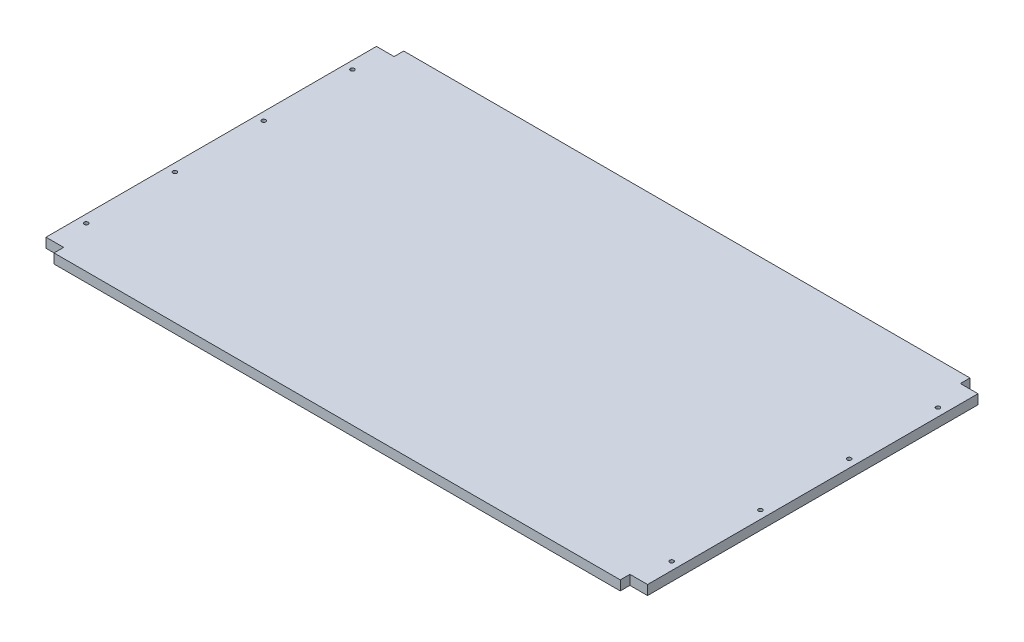
ISO-10303-21;
HEADER;
FILE_DESCRIPTION(('STEP AP214'),'2;1');
FILE_NAME('part.step','',(''),(''),'','','');
FILE_SCHEMA(('AUTOMOTIVE_DESIGN { 1 0 10303 214 1 1 1 1 }'));
ENDSEC;
DATA;
#1=APPLICATION_CONTEXT('core data for automotive mechanical design processes');
#2=APPLICATION_PROTOCOL_DEFINITION('international standard','automotive_design',2000,#1);
#3=PRODUCT_CONTEXT('',#1,'mechanical');
#4=PRODUCT('Part','Part','',(#3));
#5=PRODUCT_RELATED_PRODUCT_CATEGORY('part','',(#4));
#6=PRODUCT_DEFINITION_FORMATION('','',#4);
#7=PRODUCT_DEFINITION_CONTEXT('part definition',#1,'design');
#8=PRODUCT_DEFINITION('design','',#6,#7);
#9=PRODUCT_DEFINITION_SHAPE('','',#8);
#10=(LENGTH_UNIT() NAMED_UNIT(*) SI_UNIT(.MILLI.,.METRE.));
#11=(NAMED_UNIT(*) PLANE_ANGLE_UNIT() SI_UNIT($,.RADIAN.));
#12=(NAMED_UNIT(*) SI_UNIT($,.STERADIAN.) SOLID_ANGLE_UNIT());
#13=UNCERTAINTY_MEASURE_WITH_UNIT(LENGTH_MEASURE(1.E-05),#10,'distance_accuracy_value','');
#14=(GEOMETRIC_REPRESENTATION_CONTEXT(3) GLOBAL_UNCERTAINTY_ASSIGNED_CONTEXT((#13)) GLOBAL_UNIT_ASSIGNED_CONTEXT((#10,
#11,#12)) REPRESENTATION_CONTEXT('',''));
#15=CARTESIAN_POINT('',(0.,0.,0.));
#16=DIRECTION('',(0.,0.,1.));
#17=DIRECTION('',(1.,0.,0.));
#18=AXIS2_PLACEMENT_3D('',#15,#16,#17);
#19=CARTESIAN_POINT('',(0.,12.,0.));
#20=DIRECTION('',(0.,-1.,0.));
#21=DIRECTION('',(0.,0.,-1.));
#22=AXIS2_PLACEMENT_3D('',#19,#20,#21);
#23=PLANE('',#22);
#24=DIRECTION('',(1.,0.,0.));
#25=VECTOR('',#24,1.);
#26=CARTESIAN_POINT('',(0.,12.,0.));
#27=LINE('',#26,#25);
#28=CARTESIAN_POINT('',(0.,12.,0.));
#29=VERTEX_POINT('',#28);
#30=CARTESIAN_POINT('',(706.,12.,0.));
#31=VERTEX_POINT('',#30);
#32=EDGE_CURVE('E176',#29,#31,#27,.T.);
#33=ORIENTED_EDGE('',*,*,#32,.T.);
#34=DIRECTION('',(0.,0.,-1.));
#35=VECTOR('',#34,1.);
#36=CARTESIAN_POINT('',(706.,12.,-12.0000000000001));
#37=LINE('',#36,#35);
#38=CARTESIAN_POINT('',(706.,12.,-12.0000000000001));
#39=VERTEX_POINT('',#38);
#40=EDGE_CURVE('E104',#31,#39,#37,.T.);
#41=ORIENTED_EDGE('',*,*,#40,.T.);
#42=DIRECTION('',(1.,0.,0.));
#43=VECTOR('',#42,1.);
#44=CARTESIAN_POINT('',(728.,12.,-12.0000000000001));
#45=LINE('',#44,#43);
#46=CARTESIAN_POINT('',(728.,12.,-12.0000000000001));
#47=VERTEX_POINT('',#46);
#48=EDGE_CURVE('E203',#39,#47,#45,.T.);
#49=ORIENTED_EDGE('',*,*,#48,.T.);
#50=DIRECTION('',(0.,0.,-1.));
#51=VECTOR('',#50,1.);
#52=CARTESIAN_POINT('',(728.,12.,-424.));
#53=LINE('',#52,#51);
#54=CARTESIAN_POINT('',(728.,12.,-424.));
#55=VERTEX_POINT('',#54);
#56=EDGE_CURVE('E222',#47,#55,#53,.T.);
#57=ORIENTED_EDGE('',*,*,#56,.T.);
#58=DIRECTION('',(-1.,0.,0.));
#59=VECTOR('',#58,1.);
#60=CARTESIAN_POINT('',(706.,12.,-424.));
#61=LINE('',#60,#59);
#62=CARTESIAN_POINT('',(706.,12.,-424.));
#63=VERTEX_POINT('',#62);
#64=EDGE_CURVE('E219',#55,#63,#61,.T.);
#65=ORIENTED_EDGE('',*,*,#64,.T.);
#66=DIRECTION('',(0.,0.,-1.));
#67=VECTOR('',#66,1.);
#68=CARTESIAN_POINT('',(706.,12.,-436.));
#69=LINE('',#68,#67);
#70=CARTESIAN_POINT('',(706.,12.,-436.));
#71=VERTEX_POINT('',#70);
#72=EDGE_CURVE('E221',#63,#71,#69,.T.);
#73=ORIENTED_EDGE('',*,*,#72,.T.);
#74=DIRECTION('',(-1.,0.,0.));
#75=VECTOR('',#74,1.);
#76=CARTESIAN_POINT('',(0.,12.,-436.));
#77=LINE('',#76,#75);
#78=CARTESIAN_POINT('',(0.,12.,-436.));
#79=VERTEX_POINT('',#78);
#80=EDGE_CURVE('E224',#71,#79,#77,.T.);
#81=ORIENTED_EDGE('',*,*,#80,.T.);
#82=DIRECTION('',(0.,0.,1.));
#83=VECTOR('',#82,1.);
#84=CARTESIAN_POINT('',(0.,12.,-424.));
#85=LINE('',#84,#83);
#86=CARTESIAN_POINT('',(0.,12.,-424.));
#87=VERTEX_POINT('',#86);
#88=EDGE_CURVE('E230',#79,#87,#85,.T.);
#89=ORIENTED_EDGE('',*,*,#88,.T.);
#90=DIRECTION('',(-1.,0.,0.));
#91=VECTOR('',#90,1.);
#92=CARTESIAN_POINT('',(-22.,12.,-424.));
#93=LINE('',#92,#91);
#94=CARTESIAN_POINT('',(-22.,12.,-424.));
#95=VERTEX_POINT('',#94);
#96=EDGE_CURVE('E135',#87,#95,#93,.T.);
#97=ORIENTED_EDGE('',*,*,#96,.T.);
#98=DIRECTION('',(0.,0.,1.));
#99=VECTOR('',#98,1.);
#100=CARTESIAN_POINT('',(-22.,12.,-12.));
#101=LINE('',#100,#99);
#102=CARTESIAN_POINT('',(-22.,12.,-12.));
#103=VERTEX_POINT('',#102);
#104=EDGE_CURVE('E129',#95,#103,#101,.T.);
#105=ORIENTED_EDGE('',*,*,#104,.T.);
#106=DIRECTION('',(1.,0.,0.));
#107=VECTOR('',#106,1.);
#108=CARTESIAN_POINT('',(0.,12.,-12.));
#109=LINE('',#108,#107);
#110=CARTESIAN_POINT('',(0.,12.,-12.));
#111=VERTEX_POINT('',#110);
#112=EDGE_CURVE('E133',#103,#111,#109,.T.);
#113=ORIENTED_EDGE('',*,*,#112,.T.);
#114=DIRECTION('',(0.,0.,1.));
#115=VECTOR('',#114,1.);
#116=CARTESIAN_POINT('',(0.,12.,0.));
#117=LINE('',#116,#115);
#118=EDGE_CURVE('E49',#111,#29,#117,.T.);
#119=ORIENTED_EDGE('',*,*,#118,.T.);
#120=EDGE_LOOP('',(#33,#41,#49,#57,#65,#73,#81,#89,#97,#105,#113,#119));
#121=FACE_BOUND('',#120,.T.);
#122=CARTESIAN_POINT('',(-12.,12.,-52.));
#123=DIRECTION('',(0.,1.,0.));
#124=DIRECTION('',(0.,0.,1.));
#125=AXIS2_PLACEMENT_3D('',#122,#123,#124);
#126=CIRCLE('',#125,2.5);
#127=CARTESIAN_POINT('',(-12.,12.,-49.5));
#128=VERTEX_POINT('',#127);
#129=EDGE_CURVE('E157',#128,#128,#126,.T.);
#130=ORIENTED_EDGE('',*,*,#129,.F.);
#131=EDGE_LOOP('',(#130));
#132=FACE_BOUND('',#131,.T.);
#133=CARTESIAN_POINT('',(718.,12.,-384.));
#134=DIRECTION('',(0.,1.,0.));
#135=DIRECTION('',(0.,0.,-1.));
#136=AXIS2_PLACEMENT_3D('',#133,#134,#135);
#137=CIRCLE('',#136,2.50000000000002);
#138=CARTESIAN_POINT('',(718.,12.,-386.5));
#139=VERTEX_POINT('',#138);
#140=EDGE_CURVE('E334',#139,#139,#137,.T.);
#141=ORIENTED_EDGE('',*,*,#140,.F.);
#142=EDGE_LOOP('',(#141));
#143=FACE_BOUND('',#142,.T.);
#144=CARTESIAN_POINT('',(-12.,12.,-162.666666666667));
#145=DIRECTION('',(0.,1.,0.));
#146=DIRECTION('',(0.,0.,1.));
#147=AXIS2_PLACEMENT_3D('',#144,#145,#146);
#148=CIRCLE('',#147,2.5);
#149=CARTESIAN_POINT('',(-12.,12.,-160.166666666667));
#150=VERTEX_POINT('',#149);
#151=EDGE_CURVE('E328',#150,#150,#148,.T.);
#152=ORIENTED_EDGE('',*,*,#151,.F.);
#153=EDGE_LOOP('',(#152));
#154=FACE_BOUND('',#153,.T.);
#155=CARTESIAN_POINT('',(-12.,12.,-273.333333333333));
#156=DIRECTION('',(0.,1.,0.));
#157=DIRECTION('',(0.,0.,1.));
#158=AXIS2_PLACEMENT_3D('',#155,#156,#157);
#159=CIRCLE('',#158,2.5);
#160=CARTESIAN_POINT('',(-12.,12.,-270.833333333333));
#161=VERTEX_POINT('',#160);
#162=EDGE_CURVE('E322',#161,#161,#159,.T.);
#163=ORIENTED_EDGE('',*,*,#162,.F.);
#164=EDGE_LOOP('',(#163));
#165=FACE_BOUND('',#164,.T.);
#166=CARTESIAN_POINT('',(-12.,12.,-384.));
#167=DIRECTION('',(0.,1.,0.));
#168=DIRECTION('',(0.,0.,1.));
#169=AXIS2_PLACEMENT_3D('',#166,#167,#168);
#170=CIRCLE('',#169,2.5);
#171=CARTESIAN_POINT('',(-12.,12.,-381.5));
#172=VERTEX_POINT('',#171);
#173=EDGE_CURVE('E316',#172,#172,#170,.T.);
#174=ORIENTED_EDGE('',*,*,#173,.F.);
#175=EDGE_LOOP('',(#174));
#176=FACE_BOUND('',#175,.T.);
#177=CARTESIAN_POINT('',(718.,12.,-273.333333333333));
#178=DIRECTION('',(0.,1.,0.));
#179=DIRECTION('',(0.,0.,-1.));
#180=AXIS2_PLACEMENT_3D('',#177,#178,#179);
#181=CIRCLE('',#180,2.50000000000002);
#182=CARTESIAN_POINT('',(718.,12.,-275.833333333333));
#183=VERTEX_POINT('',#182);
#184=EDGE_CURVE('E310',#183,#183,#181,.T.);
#185=ORIENTED_EDGE('',*,*,#184,.F.);
#186=EDGE_LOOP('',(#185));
#187=FACE_BOUND('',#186,.T.);
#188=CARTESIAN_POINT('',(718.,12.,-162.666666666667));
#189=DIRECTION('',(0.,1.,0.));
#190=DIRECTION('',(0.,0.,-1.));
#191=AXIS2_PLACEMENT_3D('',#188,#189,#190);
#192=CIRCLE('',#191,2.50000000000002);
#193=CARTESIAN_POINT('',(718.,12.,-165.166666666667));
#194=VERTEX_POINT('',#193);
#195=EDGE_CURVE('E304',#194,#194,#192,.T.);
#196=ORIENTED_EDGE('',*,*,#195,.F.);
#197=EDGE_LOOP('',(#196));
#198=FACE_BOUND('',#197,.T.);
#199=CARTESIAN_POINT('',(718.,12.,-52.));
#200=DIRECTION('',(0.,1.,0.));
#201=DIRECTION('',(0.,0.,-1.));
#202=AXIS2_PLACEMENT_3D('',#199,#200,#201);
#203=CIRCLE('',#202,2.50000000000002);
#204=CARTESIAN_POINT('',(718.,12.,-54.5));
#205=VERTEX_POINT('',#204);
#206=EDGE_CURVE('E295',#205,#205,#203,.T.);
#207=ORIENTED_EDGE('',*,*,#206,.F.);
#208=EDGE_LOOP('',(#207));
#209=FACE_BOUND('',#208,.T.);
#210=ADVANCED_FACE('F32',(#121,#132,#143,#154,#165,#176,#187,#198,#209),#23,.F.);
#211=CARTESIAN_POINT('',(0.,0.,0.));
#212=DIRECTION('',(0.,-1.,0.));
#213=DIRECTION('',(0.,0.,-1.));
#214=AXIS2_PLACEMENT_3D('',#211,#212,#213);
#215=PLANE('',#214);
#216=CARTESIAN_POINT('',(718.,0.,-162.666666666667));
#217=DIRECTION('',(0.,1.,0.));
#218=DIRECTION('',(0.,0.,-1.));
#219=AXIS2_PLACEMENT_3D('',#216,#217,#218);
#220=CIRCLE('',#219,2.50000000000002);
#221=CARTESIAN_POINT('',(718.,0.,-165.166666666667));
#222=VERTEX_POINT('',#221);
#223=EDGE_CURVE('E301',#222,#222,#220,.T.);
#224=ORIENTED_EDGE('',*,*,#223,.T.);
#225=EDGE_LOOP('',(#224));
#226=FACE_BOUND('',#225,.T.);
#227=CARTESIAN_POINT('',(-12.,0.,-384.));
#228=DIRECTION('',(0.,1.,0.));
#229=DIRECTION('',(0.,0.,1.));
#230=AXIS2_PLACEMENT_3D('',#227,#228,#229);
#231=CIRCLE('',#230,2.5);
#232=CARTESIAN_POINT('',(-12.,0.,-381.5));
#233=VERTEX_POINT('',#232);
#234=EDGE_CURVE('E313',#233,#233,#231,.T.);
#235=ORIENTED_EDGE('',*,*,#234,.T.);
#236=EDGE_LOOP('',(#235));
#237=FACE_BOUND('',#236,.T.);
#238=CARTESIAN_POINT('',(-12.,0.,-162.666666666667));
#239=DIRECTION('',(0.,1.,0.));
#240=DIRECTION('',(0.,0.,1.));
#241=AXIS2_PLACEMENT_3D('',#238,#239,#240);
#242=CIRCLE('',#241,2.5);
#243=CARTESIAN_POINT('',(-12.,0.,-160.166666666667));
#244=VERTEX_POINT('',#243);
#245=EDGE_CURVE('E325',#244,#244,#242,.T.);
#246=ORIENTED_EDGE('',*,*,#245,.T.);
#247=EDGE_LOOP('',(#246));
#248=FACE_BOUND('',#247,.T.);
#249=CARTESIAN_POINT('',(-12.,0.,-52.));
#250=DIRECTION('',(0.,1.,0.));
#251=DIRECTION('',(0.,0.,1.));
#252=AXIS2_PLACEMENT_3D('',#249,#250,#251);
#253=CIRCLE('',#252,2.5);
#254=CARTESIAN_POINT('',(-12.,0.,-49.5));
#255=VERTEX_POINT('',#254);
#256=EDGE_CURVE('E337',#255,#255,#253,.T.);
#257=ORIENTED_EDGE('',*,*,#256,.T.);
#258=EDGE_LOOP('',(#257));
#259=FACE_BOUND('',#258,.T.);
#260=DIRECTION('',(1.,0.,0.));
#261=VECTOR('',#260,1.);
#262=CARTESIAN_POINT('',(0.,0.,0.));
#263=LINE('',#262,#261);
#264=CARTESIAN_POINT('',(0.,0.,0.));
#265=VERTEX_POINT('',#264);
#266=CARTESIAN_POINT('',(706.,0.,0.));
#267=VERTEX_POINT('',#266);
#268=EDGE_CURVE('E153',#265,#267,#263,.T.);
#269=ORIENTED_EDGE('',*,*,#268,.F.);
#270=DIRECTION('',(0.,0.,1.));
#271=VECTOR('',#270,1.);
#272=CARTESIAN_POINT('',(0.,0.,0.));
#273=LINE('',#272,#271);
#274=CARTESIAN_POINT('',(0.,0.,-12.));
#275=VERTEX_POINT('',#274);
#276=EDGE_CURVE('E96',#275,#265,#273,.T.);
#277=ORIENTED_EDGE('',*,*,#276,.F.);
#278=DIRECTION('',(1.,0.,0.));
#279=VECTOR('',#278,1.);
#280=CARTESIAN_POINT('',(0.,0.,-12.));
#281=LINE('',#280,#279);
#282=CARTESIAN_POINT('',(-22.,0.,-12.));
#283=VERTEX_POINT('',#282);
#284=EDGE_CURVE('E90',#283,#275,#281,.T.);
#285=ORIENTED_EDGE('',*,*,#284,.F.);
#286=DIRECTION('',(0.,0.,1.));
#287=VECTOR('',#286,1.);
#288=CARTESIAN_POINT('',(-22.,0.,-12.));
#289=LINE('',#288,#287);
#290=CARTESIAN_POINT('',(-22.,0.,-424.));
#291=VERTEX_POINT('',#290);
#292=EDGE_CURVE('E143',#291,#283,#289,.T.);
#293=ORIENTED_EDGE('',*,*,#292,.F.);
#294=DIRECTION('',(-1.,0.,0.));
#295=VECTOR('',#294,1.);
#296=CARTESIAN_POINT('',(-22.,0.,-424.));
#297=LINE('',#296,#295);
#298=CARTESIAN_POINT('',(0.,0.,-424.));
#299=VERTEX_POINT('',#298);
#300=EDGE_CURVE('E171',#299,#291,#297,.T.);
#301=ORIENTED_EDGE('',*,*,#300,.F.);
#302=DIRECTION('',(0.,0.,1.));
#303=VECTOR('',#302,1.);
#304=CARTESIAN_POINT('',(0.,0.,-424.));
#305=LINE('',#304,#303);
#306=CARTESIAN_POINT('',(0.,0.,-436.));
#307=VERTEX_POINT('',#306);
#308=EDGE_CURVE('E169',#307,#299,#305,.T.);
#309=ORIENTED_EDGE('',*,*,#308,.F.);
#310=DIRECTION('',(-1.,0.,0.));
#311=VECTOR('',#310,1.);
#312=CARTESIAN_POINT('',(0.,0.,-436.));
#313=LINE('',#312,#311);
#314=CARTESIAN_POINT('',(706.,0.,-436.));
#315=VERTEX_POINT('',#314);
#316=EDGE_CURVE('E167',#315,#307,#313,.T.);
#317=ORIENTED_EDGE('',*,*,#316,.F.);
#318=DIRECTION('',(0.,0.,-1.));
#319=VECTOR('',#318,1.);
#320=CARTESIAN_POINT('',(706.,0.,-436.));
#321=LINE('',#320,#319);
#322=CARTESIAN_POINT('',(706.,0.,-424.));
#323=VERTEX_POINT('',#322);
#324=EDGE_CURVE('E165',#323,#315,#321,.T.);
#325=ORIENTED_EDGE('',*,*,#324,.F.);
#326=DIRECTION('',(-1.,0.,0.));
#327=VECTOR('',#326,1.);
#328=CARTESIAN_POINT('',(706.,0.,-424.));
#329=LINE('',#328,#327);
#330=CARTESIAN_POINT('',(728.,0.,-424.));
#331=VERTEX_POINT('',#330);
#332=EDGE_CURVE('E163',#331,#323,#329,.T.);
#333=ORIENTED_EDGE('',*,*,#332,.F.);
#334=DIRECTION('',(0.,0.,-1.));
#335=VECTOR('',#334,1.);
#336=CARTESIAN_POINT('',(728.,0.,-424.));
#337=LINE('',#336,#335);
#338=CARTESIAN_POINT('',(728.,0.,-12.0000000000001));
#339=VERTEX_POINT('',#338);
#340=EDGE_CURVE('E161',#339,#331,#337,.T.);
#341=ORIENTED_EDGE('',*,*,#340,.F.);
#342=DIRECTION('',(1.,0.,0.));
#343=VECTOR('',#342,1.);
#344=CARTESIAN_POINT('',(728.,0.,-12.0000000000001));
#345=LINE('',#344,#343);
#346=CARTESIAN_POINT('',(706.,0.,-12.0000000000001));
#347=VERTEX_POINT('',#346);
#348=EDGE_CURVE('E159',#347,#339,#345,.T.);
#349=ORIENTED_EDGE('',*,*,#348,.F.);
#350=DIRECTION('',(0.,0.,-1.));
#351=VECTOR('',#350,1.);
#352=CARTESIAN_POINT('',(706.,0.,-12.0000000000001));
#353=LINE('',#352,#351);
#354=EDGE_CURVE('E156',#267,#347,#353,.T.);
#355=ORIENTED_EDGE('',*,*,#354,.F.);
#356=EDGE_LOOP('',(#269,#277,#285,#293,#301,#309,#317,#325,#333,#341,#349,#355));
#357=FACE_BOUND('',#356,.T.);
#358=CARTESIAN_POINT('',(718.,0.,-384.));
#359=DIRECTION('',(0.,1.,0.));
#360=DIRECTION('',(0.,0.,-1.));
#361=AXIS2_PLACEMENT_3D('',#358,#359,#360);
#362=CIRCLE('',#361,2.50000000000002);
#363=CARTESIAN_POINT('',(718.,0.,-386.5));
#364=VERTEX_POINT('',#363);
#365=EDGE_CURVE('E331',#364,#364,#362,.T.);
#366=ORIENTED_EDGE('',*,*,#365,.T.);
#367=EDGE_LOOP('',(#366));
#368=FACE_BOUND('',#367,.T.);
#369=CARTESIAN_POINT('',(-12.,0.,-273.333333333333));
#370=DIRECTION('',(0.,1.,0.));
#371=DIRECTION('',(0.,0.,1.));
#372=AXIS2_PLACEMENT_3D('',#369,#370,#371);
#373=CIRCLE('',#372,2.5);
#374=CARTESIAN_POINT('',(-12.,0.,-270.833333333333));
#375=VERTEX_POINT('',#374);
#376=EDGE_CURVE('E319',#375,#375,#373,.T.);
#377=ORIENTED_EDGE('',*,*,#376,.T.);
#378=EDGE_LOOP('',(#377));
#379=FACE_BOUND('',#378,.T.);
#380=CARTESIAN_POINT('',(718.,0.,-273.333333333333));
#381=DIRECTION('',(0.,1.,0.));
#382=DIRECTION('',(0.,0.,-1.));
#383=AXIS2_PLACEMENT_3D('',#380,#381,#382);
#384=CIRCLE('',#383,2.50000000000002);
#385=CARTESIAN_POINT('',(718.,0.,-275.833333333333));
#386=VERTEX_POINT('',#385);
#387=EDGE_CURVE('E307',#386,#386,#384,.T.);
#388=ORIENTED_EDGE('',*,*,#387,.T.);
#389=EDGE_LOOP('',(#388));
#390=FACE_BOUND('',#389,.T.);
#391=CARTESIAN_POINT('',(718.,0.,-52.));
#392=DIRECTION('',(0.,1.,0.));
#393=DIRECTION('',(0.,0.,-1.));
#394=AXIS2_PLACEMENT_3D('',#391,#392,#393);
#395=CIRCLE('',#394,2.50000000000002);
#396=CARTESIAN_POINT('',(718.,0.,-54.5));
#397=VERTEX_POINT('',#396);
#398=EDGE_CURVE('E298',#397,#397,#395,.T.);
#399=ORIENTED_EDGE('',*,*,#398,.T.);
#400=EDGE_LOOP('',(#399));
#401=FACE_BOUND('',#400,.T.);
#402=ADVANCED_FACE('F207',(#226,#237,#248,#259,#357,#368,#379,#390,#401),#215,.T.);
#403=CARTESIAN_POINT('',(0.,12.,0.));
#404=DIRECTION('',(0.,0.,-1.));
#405=DIRECTION('',(-1.,0.,0.));
#406=AXIS2_PLACEMENT_3D('',#403,#404,#405);
#407=PLANE('',#406);
#408=ORIENTED_EDGE('',*,*,#268,.T.);
#409=DIRECTION('',(0.,-1.,0.));
#410=VECTOR('',#409,1.);
#411=CARTESIAN_POINT('',(706.,12.,0.));
#412=LINE('',#411,#410);
#413=EDGE_CURVE('E11',#31,#267,#412,.T.);
#414=ORIENTED_EDGE('',*,*,#413,.F.);
#415=ORIENTED_EDGE('',*,*,#32,.F.);
#416=DIRECTION('',(0.,-1.,0.));
#417=VECTOR('',#416,1.);
#418=CARTESIAN_POINT('',(0.,12.,0.));
#419=LINE('',#418,#417);
#420=EDGE_CURVE('E149',#29,#265,#419,.T.);
#421=ORIENTED_EDGE('',*,*,#420,.T.);
#422=EDGE_LOOP('',(#408,#414,#415,#421));
#423=FACE_BOUND('',#422,.T.);
#424=ADVANCED_FACE('F34',(#423),#407,.F.);
#425=CARTESIAN_POINT('',(706.,12.,-12.0000000000001));
#426=DIRECTION('',(-1.,0.,0.));
#427=DIRECTION('',(0.,0.,1.));
#428=AXIS2_PLACEMENT_3D('',#425,#426,#427);
#429=PLANE('',#428);
#430=ORIENTED_EDGE('',*,*,#354,.T.);
#431=DIRECTION('',(0.,-1.,0.));
#432=VECTOR('',#431,1.);
#433=CARTESIAN_POINT('',(706.,12.,-12.0000000000001));
#434=LINE('',#433,#432);
#435=EDGE_CURVE('E41',#39,#347,#434,.T.);
#436=ORIENTED_EDGE('',*,*,#435,.F.);
#437=ORIENTED_EDGE('',*,*,#40,.F.);
#438=ORIENTED_EDGE('',*,*,#413,.T.);
#439=EDGE_LOOP('',(#430,#436,#437,#438));
#440=FACE_BOUND('',#439,.T.);
#441=ADVANCED_FACE('F485',(#440),#429,.F.);
#442=CARTESIAN_POINT('',(728.,12.,-12.0000000000001));
#443=DIRECTION('',(0.,0.,-1.));
#444=DIRECTION('',(-1.,0.,0.));
#445=AXIS2_PLACEMENT_3D('',#442,#443,#444);
#446=PLANE('',#445);
#447=ORIENTED_EDGE('',*,*,#348,.T.);
#448=DIRECTION('',(0.,-1.,0.));
#449=VECTOR('',#448,1.);
#450=CARTESIAN_POINT('',(728.,12.,-12.0000000000001));
#451=LINE('',#450,#449);
#452=EDGE_CURVE('E195',#47,#339,#451,.T.);
#453=ORIENTED_EDGE('',*,*,#452,.F.);
#454=ORIENTED_EDGE('',*,*,#48,.F.);
#455=ORIENTED_EDGE('',*,*,#435,.T.);
#456=EDGE_LOOP('',(#447,#453,#454,#455));
#457=FACE_BOUND('',#456,.T.);
#458=ADVANCED_FACE('F201',(#457),#446,.F.);
#459=CARTESIAN_POINT('',(728.,12.,-424.));
#460=DIRECTION('',(-1.,0.,0.));
#461=DIRECTION('',(0.,0.,1.));
#462=AXIS2_PLACEMENT_3D('',#459,#460,#461);
#463=PLANE('',#462);
#464=ORIENTED_EDGE('',*,*,#340,.T.);
#465=DIRECTION('',(0.,-1.,0.));
#466=VECTOR('',#465,1.);
#467=CARTESIAN_POINT('',(728.,12.,-424.));
#468=LINE('',#467,#466);
#469=EDGE_CURVE('E192',#55,#331,#468,.T.);
#470=ORIENTED_EDGE('',*,*,#469,.F.);
#471=ORIENTED_EDGE('',*,*,#56,.F.);
#472=ORIENTED_EDGE('',*,*,#452,.T.);
#473=EDGE_LOOP('',(#464,#470,#471,#472));
#474=FACE_BOUND('',#473,.T.);
#475=ADVANCED_FACE('F213',(#474),#463,.F.);
#476=CARTESIAN_POINT('',(706.,12.,-424.));
#477=DIRECTION('',(0.,0.,1.));
#478=DIRECTION('',(1.,0.,0.));
#479=AXIS2_PLACEMENT_3D('',#476,#477,#478);
#480=PLANE('',#479);
#481=ORIENTED_EDGE('',*,*,#332,.T.);
#482=DIRECTION('',(0.,-1.,0.));
#483=VECTOR('',#482,1.);
#484=CARTESIAN_POINT('',(706.,12.,-424.));
#485=LINE('',#484,#483);
#486=EDGE_CURVE('E189',#63,#323,#485,.T.);
#487=ORIENTED_EDGE('',*,*,#486,.F.);
#488=ORIENTED_EDGE('',*,*,#64,.F.);
#489=ORIENTED_EDGE('',*,*,#469,.T.);
#490=EDGE_LOOP('',(#481,#487,#488,#489));
#491=FACE_BOUND('',#490,.T.);
#492=ADVANCED_FACE('F217',(#491),#480,.F.);
#493=CARTESIAN_POINT('',(706.,12.,-436.));
#494=DIRECTION('',(-1.,0.,0.));
#495=DIRECTION('',(0.,0.,1.));
#496=AXIS2_PLACEMENT_3D('',#493,#494,#495);
#497=PLANE('',#496);
#498=ORIENTED_EDGE('',*,*,#324,.T.);
#499=DIRECTION('',(0.,-1.,0.));
#500=VECTOR('',#499,1.);
#501=CARTESIAN_POINT('',(706.,12.,-436.));
#502=LINE('',#501,#500);
#503=EDGE_CURVE('E186',#71,#315,#502,.T.);
#504=ORIENTED_EDGE('',*,*,#503,.F.);
#505=ORIENTED_EDGE('',*,*,#72,.F.);
#506=ORIENTED_EDGE('',*,*,#486,.T.);
#507=EDGE_LOOP('',(#498,#504,#505,#506));
#508=FACE_BOUND('',#507,.T.);
#509=ADVANCED_FACE('F450',(#508),#497,.F.);
#510=CARTESIAN_POINT('',(0.,12.,-436.));
#511=DIRECTION('',(0.,0.,1.));
#512=DIRECTION('',(1.,0.,0.));
#513=AXIS2_PLACEMENT_3D('',#510,#511,#512);
#514=PLANE('',#513);
#515=ORIENTED_EDGE('',*,*,#316,.T.);
#516=DIRECTION('',(0.,-1.,0.));
#517=VECTOR('',#516,1.);
#518=CARTESIAN_POINT('',(0.,12.,-436.));
#519=LINE('',#518,#517);
#520=EDGE_CURVE('E183',#79,#307,#519,.T.);
#521=ORIENTED_EDGE('',*,*,#520,.F.);
#522=ORIENTED_EDGE('',*,*,#80,.F.);
#523=ORIENTED_EDGE('',*,*,#503,.T.);
#524=EDGE_LOOP('',(#515,#521,#522,#523));
#525=FACE_BOUND('',#524,.T.);
#526=ADVANCED_FACE('F441',(#525),#514,.F.);
#527=CARTESIAN_POINT('',(0.,12.,-424.));
#528=DIRECTION('',(1.,0.,0.));
#529=DIRECTION('',(0.,0.,-1.));
#530=AXIS2_PLACEMENT_3D('',#527,#528,#529);
#531=PLANE('',#530);
#532=ORIENTED_EDGE('',*,*,#308,.T.);
#533=DIRECTION('',(0.,-1.,0.));
#534=VECTOR('',#533,1.);
#535=CARTESIAN_POINT('',(0.,12.,-424.));
#536=LINE('',#535,#534);
#537=EDGE_CURVE('E180',#87,#299,#536,.T.);
#538=ORIENTED_EDGE('',*,*,#537,.F.);
#539=ORIENTED_EDGE('',*,*,#88,.F.);
#540=ORIENTED_EDGE('',*,*,#520,.T.);
#541=EDGE_LOOP('',(#532,#538,#539,#540));
#542=FACE_BOUND('',#541,.T.);
#543=ADVANCED_FACE('F236',(#542),#531,.F.);
#544=CARTESIAN_POINT('',(-22.,12.,-424.));
#545=DIRECTION('',(0.,0.,1.));
#546=DIRECTION('',(1.,0.,0.));
#547=AXIS2_PLACEMENT_3D('',#544,#545,#546);
#548=PLANE('',#547);
#549=ORIENTED_EDGE('',*,*,#300,.T.);
#550=DIRECTION('',(0.,-1.,0.));
#551=VECTOR('',#550,1.);
#552=CARTESIAN_POINT('',(-22.,12.,-424.));
#553=LINE('',#552,#551);
#554=EDGE_CURVE('E144',#95,#291,#553,.T.);
#555=ORIENTED_EDGE('',*,*,#554,.F.);
#556=ORIENTED_EDGE('',*,*,#96,.F.);
#557=ORIENTED_EDGE('',*,*,#537,.T.);
#558=EDGE_LOOP('',(#549,#555,#556,#557));
#559=FACE_BOUND('',#558,.T.);
#560=ADVANCED_FACE('F240',(#559),#548,.F.);
#561=CARTESIAN_POINT('',(-22.,12.,-12.));
#562=DIRECTION('',(1.,0.,0.));
#563=DIRECTION('',(0.,0.,-1.));
#564=AXIS2_PLACEMENT_3D('',#561,#562,#563);
#565=PLANE('',#564);
#566=ORIENTED_EDGE('',*,*,#292,.T.);
#567=DIRECTION('',(0.,-1.,0.));
#568=VECTOR('',#567,1.);
#569=CARTESIAN_POINT('',(-22.,12.,-12.));
#570=LINE('',#569,#568);
#571=EDGE_CURVE('E140',#103,#283,#570,.T.);
#572=ORIENTED_EDGE('',*,*,#571,.F.);
#573=ORIENTED_EDGE('',*,*,#104,.F.);
#574=ORIENTED_EDGE('',*,*,#554,.T.);
#575=EDGE_LOOP('',(#566,#572,#573,#574));
#576=FACE_BOUND('',#575,.T.);
#577=ADVANCED_FACE('F141',(#576),#565,.F.);
#578=CARTESIAN_POINT('',(0.,12.,-12.));
#579=DIRECTION('',(0.,0.,-1.));
#580=DIRECTION('',(-1.,0.,0.));
#581=AXIS2_PLACEMENT_3D('',#578,#579,#580);
#582=PLANE('',#581);
#583=ORIENTED_EDGE('',*,*,#284,.T.);
#584=DIRECTION('',(0.,-1.,0.));
#585=VECTOR('',#584,1.);
#586=CARTESIAN_POINT('',(0.,12.,-12.));
#587=LINE('',#586,#585);
#588=EDGE_CURVE('E145',#111,#275,#587,.T.);
#589=ORIENTED_EDGE('',*,*,#588,.F.);
#590=ORIENTED_EDGE('',*,*,#112,.F.);
#591=ORIENTED_EDGE('',*,*,#571,.T.);
#592=EDGE_LOOP('',(#583,#589,#590,#591));
#593=FACE_BOUND('',#592,.T.);
#594=ADVANCED_FACE('F147',(#593),#582,.F.);
#595=CARTESIAN_POINT('',(0.,12.,0.));
#596=DIRECTION('',(1.,0.,0.));
#597=DIRECTION('',(0.,0.,-1.));
#598=AXIS2_PLACEMENT_3D('',#595,#596,#597);
#599=PLANE('',#598);
#600=ORIENTED_EDGE('',*,*,#276,.T.);
#601=ORIENTED_EDGE('',*,*,#420,.F.);
#602=ORIENTED_EDGE('',*,*,#118,.F.);
#603=ORIENTED_EDGE('',*,*,#588,.T.);
#604=EDGE_LOOP('',(#600,#601,#602,#603));
#605=FACE_BOUND('',#604,.T.);
#606=ADVANCED_FACE('F244',(#605),#599,.F.);
#607=CARTESIAN_POINT('',(-12.,12.,-52.));
#608=DIRECTION('',(0.,-1.,0.));
#609=DIRECTION('',(0.,0.,-1.));
#610=AXIS2_PLACEMENT_3D('',#607,#608,#609);
#611=CYLINDRICAL_SURFACE('',#610,2.5);
#612=ORIENTED_EDGE('',*,*,#129,.T.);
#613=EDGE_LOOP('',(#612));
#614=FACE_BOUND('',#613,.T.);
#615=ORIENTED_EDGE('',*,*,#256,.F.);
#616=EDGE_LOOP('',(#615));
#617=FACE_BOUND('',#616,.T.);
#618=ADVANCED_FACE('F246',(#614,#617),#611,.F.);
#619=CARTESIAN_POINT('',(718.,12.,-384.));
#620=DIRECTION('',(0.,-1.,0.));
#621=DIRECTION('',(0.,0.,-1.));
#622=AXIS2_PLACEMENT_3D('',#619,#620,#621);
#623=CYLINDRICAL_SURFACE('',#622,2.50000000000002);
#624=ORIENTED_EDGE('',*,*,#140,.T.);
#625=EDGE_LOOP('',(#624));
#626=FACE_BOUND('',#625,.T.);
#627=ORIENTED_EDGE('',*,*,#365,.F.);
#628=EDGE_LOOP('',(#627));
#629=FACE_BOUND('',#628,.T.);
#630=ADVANCED_FACE('F252',(#626,#629),#623,.F.);
#631=CARTESIAN_POINT('',(-12.,12.,-162.666666666667));
#632=DIRECTION('',(0.,-1.,0.));
#633=DIRECTION('',(0.,0.,-1.));
#634=AXIS2_PLACEMENT_3D('',#631,#632,#633);
#635=CYLINDRICAL_SURFACE('',#634,2.5);
#636=ORIENTED_EDGE('',*,*,#151,.T.);
#637=EDGE_LOOP('',(#636));
#638=FACE_BOUND('',#637,.T.);
#639=ORIENTED_EDGE('',*,*,#245,.F.);
#640=EDGE_LOOP('',(#639));
#641=FACE_BOUND('',#640,.T.);
#642=ADVANCED_FACE('F266',(#638,#641),#635,.F.);
#643=CARTESIAN_POINT('',(-12.,12.,-273.333333333333));
#644=DIRECTION('',(0.,-1.,0.));
#645=DIRECTION('',(0.,0.,-1.));
#646=AXIS2_PLACEMENT_3D('',#643,#644,#645);
#647=CYLINDRICAL_SURFACE('',#646,2.5);
#648=ORIENTED_EDGE('',*,*,#162,.T.);
#649=EDGE_LOOP('',(#648));
#650=FACE_BOUND('',#649,.T.);
#651=ORIENTED_EDGE('',*,*,#376,.F.);
#652=EDGE_LOOP('',(#651));
#653=FACE_BOUND('',#652,.T.);
#654=ADVANCED_FACE('F270',(#650,#653),#647,.F.);
#655=CARTESIAN_POINT('',(-12.,12.,-384.));
#656=DIRECTION('',(0.,-1.,0.));
#657=DIRECTION('',(0.,0.,-1.));
#658=AXIS2_PLACEMENT_3D('',#655,#656,#657);
#659=CYLINDRICAL_SURFACE('',#658,2.5);
#660=ORIENTED_EDGE('',*,*,#173,.T.);
#661=EDGE_LOOP('',(#660));
#662=FACE_BOUND('',#661,.T.);
#663=ORIENTED_EDGE('',*,*,#234,.F.);
#664=EDGE_LOOP('',(#663));
#665=FACE_BOUND('',#664,.T.);
#666=ADVANCED_FACE('F274',(#662,#665),#659,.F.);
#667=CARTESIAN_POINT('',(718.,12.,-273.333333333333));
#668=DIRECTION('',(0.,-1.,0.));
#669=DIRECTION('',(0.,0.,-1.));
#670=AXIS2_PLACEMENT_3D('',#667,#668,#669);
#671=CYLINDRICAL_SURFACE('',#670,2.50000000000002);
#672=ORIENTED_EDGE('',*,*,#184,.T.);
#673=EDGE_LOOP('',(#672));
#674=FACE_BOUND('',#673,.T.);
#675=ORIENTED_EDGE('',*,*,#387,.F.);
#676=EDGE_LOOP('',(#675));
#677=FACE_BOUND('',#676,.T.);
#678=ADVANCED_FACE('F278',(#674,#677),#671,.F.);
#679=CARTESIAN_POINT('',(718.,12.,-162.666666666667));
#680=DIRECTION('',(0.,-1.,0.));
#681=DIRECTION('',(0.,0.,-1.));
#682=AXIS2_PLACEMENT_3D('',#679,#680,#681);
#683=CYLINDRICAL_SURFACE('',#682,2.50000000000002);
#684=ORIENTED_EDGE('',*,*,#195,.T.);
#685=EDGE_LOOP('',(#684));
#686=FACE_BOUND('',#685,.T.);
#687=ORIENTED_EDGE('',*,*,#223,.F.);
#688=EDGE_LOOP('',(#687));
#689=FACE_BOUND('',#688,.T.);
#690=ADVANCED_FACE('F282',(#686,#689),#683,.F.);
#691=CARTESIAN_POINT('',(718.,12.,-52.));
#692=DIRECTION('',(0.,-1.,0.));
#693=DIRECTION('',(0.,0.,-1.));
#694=AXIS2_PLACEMENT_3D('',#691,#692,#693);
#695=CYLINDRICAL_SURFACE('',#694,2.50000000000002);
#696=ORIENTED_EDGE('',*,*,#206,.T.);
#697=EDGE_LOOP('',(#696));
#698=FACE_BOUND('',#697,.T.);
#699=ORIENTED_EDGE('',*,*,#398,.F.);
#700=EDGE_LOOP('',(#699));
#701=FACE_BOUND('',#700,.T.);
#702=ADVANCED_FACE('F286',(#698,#701),#695,.F.);
#703=CLOSED_SHELL('',(#210,#402,#424,#441,#458,#475,#492,#509,#526,#543,#560,#577,#594,#606,
#618,#630,#642,#654,#666,#678,#690,#702));
#704=MANIFOLD_SOLID_BREP('B2',#703);
#705=ADVANCED_BREP_SHAPE_REPRESENTATION('',(#18,#704),#14);
#706=SHAPE_DEFINITION_REPRESENTATION(#9,#705);
ENDSEC;
END-ISO-10303-21;
